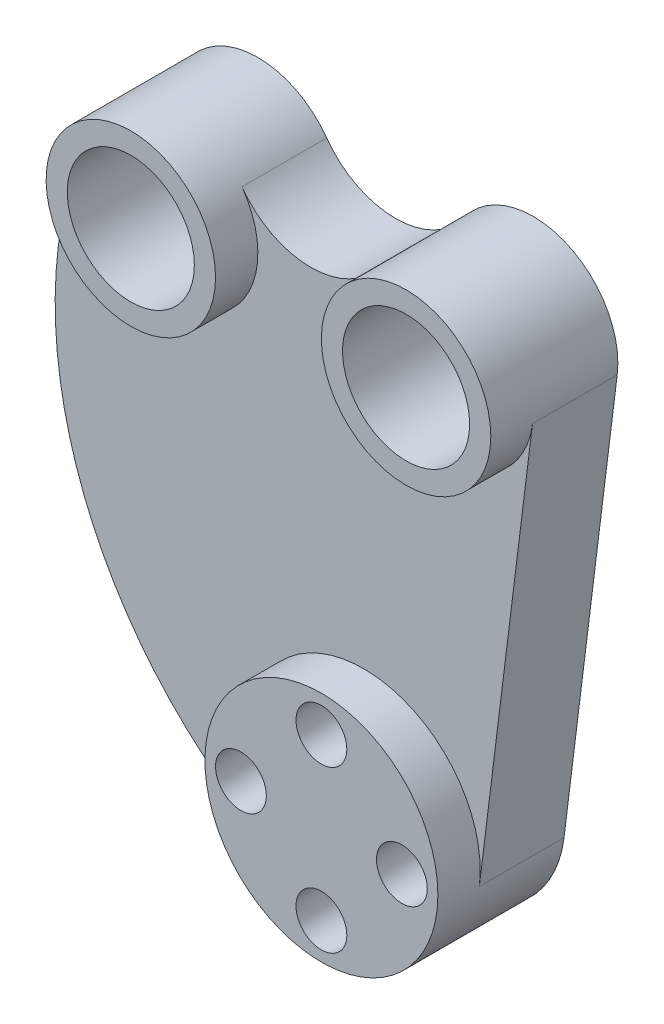
ISO-10303-21;
HEADER;
FILE_DESCRIPTION(('STEP AP214'),'2;1');
FILE_NAME('part.step','',(''),(''),'','','');
FILE_SCHEMA(('AUTOMOTIVE_DESIGN { 1 0 10303 214 1 1 1 1 }'));
ENDSEC;
DATA;
#1=APPLICATION_CONTEXT('core data for automotive mechanical design processes');
#2=APPLICATION_PROTOCOL_DEFINITION('international standard','automotive_design',2000,#1);
#3=PRODUCT_CONTEXT('',#1,'mechanical');
#4=PRODUCT('Part','Part','',(#3));
#5=PRODUCT_RELATED_PRODUCT_CATEGORY('part','',(#4));
#6=PRODUCT_DEFINITION_FORMATION('','',#4);
#7=PRODUCT_DEFINITION_CONTEXT('part definition',#1,'design');
#8=PRODUCT_DEFINITION('design','',#6,#7);
#9=PRODUCT_DEFINITION_SHAPE('','',#8);
#10=(LENGTH_UNIT() NAMED_UNIT(*) SI_UNIT(.MILLI.,.METRE.));
#11=(NAMED_UNIT(*) PLANE_ANGLE_UNIT() SI_UNIT($,.RADIAN.));
#12=(NAMED_UNIT(*) SI_UNIT($,.STERADIAN.) SOLID_ANGLE_UNIT());
#13=UNCERTAINTY_MEASURE_WITH_UNIT(LENGTH_MEASURE(1.E-05),#10,'distance_accuracy_value','');
#14=(GEOMETRIC_REPRESENTATION_CONTEXT(3) GLOBAL_UNCERTAINTY_ASSIGNED_CONTEXT((#13)) GLOBAL_UNIT_ASSIGNED_CONTEXT((#10,
#11,#12)) REPRESENTATION_CONTEXT('',''));
#15=CARTESIAN_POINT('',(0.,0.,0.));
#16=DIRECTION('',(0.,0.,1.));
#17=DIRECTION('',(1.,0.,0.));
#18=AXIS2_PLACEMENT_3D('',#15,#16,#17);
#19=CARTESIAN_POINT('',(70.1351833491974,-34.1329174928612,20.));
#20=DIRECTION('',(0.,0.,-1.));
#21=DIRECTION('',(-1.,0.,0.));
#22=AXIS2_PLACEMENT_3D('',#19,#20,#21);
#23=CYLINDRICAL_SURFACE('',#22,98.);
#24=CARTESIAN_POINT('',(70.1351833491974,-34.1329174928612,0.));
#25=DIRECTION('',(0.,0.,1.));
#26=DIRECTION('',(1.,0.,0.));
#27=AXIS2_PLACEMENT_3D('',#24,#25,#26);
#28=CIRCLE('',#27,98.);
#29=CARTESIAN_POINT('',(-17.983380345948,8.75203012637466,0.));
#30=VERTEX_POINT('',#29);
#31=CARTESIAN_POINT('',(35.1954958566961,-125.692833602075,0.));
#32=VERTEX_POINT('',#31);
#33=EDGE_CURVE('E111',#30,#32,#28,.T.);
#34=ORIENTED_EDGE('',*,*,#33,.T.);
#35=DIRECTION('',(0.,0.,-1.));
#36=VECTOR('',#35,1.);
#37=CARTESIAN_POINT('',(35.1954958566961,-125.692833602075,20.));
#38=LINE('',#37,#36);
#39=CARTESIAN_POINT('',(35.1954958566961,-125.692833602075,20.));
#40=VERTEX_POINT('',#39);
#41=EDGE_CURVE('E44',#40,#32,#38,.T.);
#42=ORIENTED_EDGE('',*,*,#41,.F.);
#43=CARTESIAN_POINT('',(70.1351833491974,-34.1329174928612,20.));
#44=DIRECTION('',(0.,0.,1.));
#45=DIRECTION('',(1.,0.,0.));
#46=AXIS2_PLACEMENT_3D('',#43,#44,#45);
#47=CIRCLE('',#46,98.);
#48=CARTESIAN_POINT('',(-17.983380345948,8.75203012637466,20.));
#49=VERTEX_POINT('',#48);
#50=EDGE_CURVE('E139',#49,#40,#47,.T.);
#51=ORIENTED_EDGE('',*,*,#50,.F.);
#52=DIRECTION('',(0.,0.,-1.));
#53=VECTOR('',#52,1.);
#54=CARTESIAN_POINT('',(-17.983380345948,8.75203012637466,20.));
#55=LINE('',#54,#53);
#56=EDGE_CURVE('E11',#49,#30,#55,.T.);
#57=ORIENTED_EDGE('',*,*,#56,.T.);
#58=EDGE_LOOP('',(#34,#42,#51,#57));
#59=FACE_BOUND('',#58,.T.);
#60=ADVANCED_FACE('F37',(#59),#23,.T.);
#61=CARTESIAN_POINT('',(83.8560575792752,-10.4335133267594,20.));
#62=DIRECTION('',(0.992348346481154,-0.123469669296231,0.));
#63=DIRECTION('',(0.123469669296231,0.992348346481154,0.));
#64=AXIS2_PLACEMENT_3D('',#61,#62,#63);
#65=PLANE('',#64);
#66=DIRECTION('',(-0.123469669296231,-0.992348346481154,0.));
#67=VECTOR('',#66,1.);
#68=CARTESIAN_POINT('',(83.8560575792752,-10.4335133267594,0.));
#69=LINE('',#68,#67);
#70=CARTESIAN_POINT('',(84.8469669296231,-2.46939338592461,0.));
#71=VERTEX_POINT('',#70);
#72=CARTESIAN_POINT('',(72.2895795282317,-103.395415905646,0.));
#73=VERTEX_POINT('',#72);
#74=EDGE_CURVE('E103',#71,#73,#69,.T.);
#75=ORIENTED_EDGE('',*,*,#74,.F.);
#76=DIRECTION('',(0.,0.,-1.));
#77=VECTOR('',#76,1.);
#78=CARTESIAN_POINT('',(84.8469669296231,-2.46939338592461,20.));
#79=LINE('',#78,#77);
#80=CARTESIAN_POINT('',(84.8469669296231,-2.46939338592462,20.));
#81=VERTEX_POINT('',#80);
#82=EDGE_CURVE('E106',#81,#71,#79,.T.);
#83=ORIENTED_EDGE('',*,*,#82,.F.);
#84=DIRECTION('',(-0.123469669296231,-0.992348346481154,0.));
#85=VECTOR('',#84,1.);
#86=CARTESIAN_POINT('',(83.8560575792752,-10.4335133267594,20.));
#87=LINE('',#86,#85);
#88=CARTESIAN_POINT('',(72.2895795282317,-103.395415905646,20.));
#89=VERTEX_POINT('',#88);
#90=EDGE_CURVE('E105',#81,#89,#87,.T.);
#91=ORIENTED_EDGE('',*,*,#90,.T.);
#92=DIRECTION('',(0.,0.,-1.));
#93=VECTOR('',#92,1.);
#94=CARTESIAN_POINT('',(72.2895795282317,-103.395415905646,20.));
#95=LINE('',#94,#93);
#96=EDGE_CURVE('E91',#89,#73,#95,.T.);
#97=ORIENTED_EDGE('',*,*,#96,.T.);
#98=EDGE_LOOP('',(#75,#83,#91,#97));
#99=FACE_BOUND('',#98,.T.);
#100=ADVANCED_FACE('F101',(#99),#65,.T.);
#101=CARTESIAN_POINT('',(32.5,23.318447632722,20.));
#102=DIRECTION('',(0.,0.,-1.));
#103=DIRECTION('',(-1.,0.,0.));
#104=AXIS2_PLACEMENT_3D('',#101,#102,#103);
#105=CYLINDRICAL_SURFACE('',#104,20.);
#106=CARTESIAN_POINT('',(32.5,23.318447632722,0.));
#107=DIRECTION('',(0.,0.,1.));
#108=DIRECTION('',(1.,0.,0.));
#109=AXIS2_PLACEMENT_3D('',#106,#107,#108);
#110=CIRCLE('',#109,20.);
#111=CARTESIAN_POINT('',(16.25,11.659223816361,0.));
#112=VERTEX_POINT('',#111);
#113=CARTESIAN_POINT('',(48.75,11.659223816361,0.));
#114=VERTEX_POINT('',#113);
#115=EDGE_CURVE('E110',#112,#114,#110,.T.);
#116=ORIENTED_EDGE('',*,*,#115,.F.);
#117=DIRECTION('',(0.,0.,-1.));
#118=VECTOR('',#117,1.);
#119=CARTESIAN_POINT('',(16.25,11.659223816361,20.));
#120=LINE('',#119,#118);
#121=CARTESIAN_POINT('',(16.25,11.659223816361,20.));
#122=VERTEX_POINT('',#121);
#123=EDGE_CURVE('E119',#122,#112,#120,.T.);
#124=ORIENTED_EDGE('',*,*,#123,.F.);
#125=CARTESIAN_POINT('',(32.5,23.318447632722,20.));
#126=DIRECTION('',(0.,0.,1.));
#127=DIRECTION('',(1.,0.,0.));
#128=AXIS2_PLACEMENT_3D('',#125,#126,#127);
#129=CIRCLE('',#128,20.);
#130=CARTESIAN_POINT('',(48.75,11.659223816361,20.));
#131=VERTEX_POINT('',#130);
#132=EDGE_CURVE('E122',#122,#131,#129,.T.);
#133=ORIENTED_EDGE('',*,*,#132,.T.);
#134=DIRECTION('',(0.,0.,-1.));
#135=VECTOR('',#134,1.);
#136=CARTESIAN_POINT('',(48.75,11.659223816361,20.));
#137=LINE('',#136,#135);
#138=EDGE_CURVE('E121',#131,#114,#137,.T.);
#139=ORIENTED_EDGE('',*,*,#138,.T.);
#140=EDGE_LOOP('',(#116,#124,#133,#139));
#141=FACE_BOUND('',#140,.T.);
#142=ADVANCED_FACE('F145',(#141),#105,.F.);
#143=CARTESIAN_POINT('',(0.,0.,20.));
#144=DIRECTION('',(0.,0.,1.));
#145=DIRECTION('',(1.,0.,0.));
#146=AXIS2_PLACEMENT_3D('',#143,#144,#145);
#147=PLANE('',#146);
#148=CARTESIAN_POINT('',(0.,0.,20.));
#149=DIRECTION('',(0.,0.,1.));
#150=DIRECTION('',(1.,0.,0.));
#151=AXIS2_PLACEMENT_3D('',#148,#149,#150);
#152=CIRCLE('',#151,20.);
#153=EDGE_CURVE('E113',#49,#122,#152,.T.);
#154=ORIENTED_EDGE('',*,*,#153,.F.);
#155=ORIENTED_EDGE('',*,*,#50,.T.);
#156=CARTESIAN_POINT('',(45.,-100.,20.));
#157=DIRECTION('',(0.,0.,1.));
#158=DIRECTION('',(1.,0.,0.));
#159=AXIS2_PLACEMENT_3D('',#156,#157,#158);
#160=CIRCLE('',#159,27.5);
#161=EDGE_CURVE('E136',#89,#40,#160,.T.);
#162=ORIENTED_EDGE('',*,*,#161,.F.);
#163=ORIENTED_EDGE('',*,*,#90,.F.);
#164=CARTESIAN_POINT('',(65.,0.,20.));
#165=DIRECTION('',(0.,0.,1.));
#166=DIRECTION('',(1.,0.,0.));
#167=AXIS2_PLACEMENT_3D('',#164,#165,#166);
#168=CIRCLE('',#167,20.);
#169=EDGE_CURVE('E129',#131,#81,#168,.T.);
#170=ORIENTED_EDGE('',*,*,#169,.F.);
#171=ORIENTED_EDGE('',*,*,#132,.F.);
#172=EDGE_LOOP('',(#154,#155,#162,#163,#170,#171));
#173=FACE_BOUND('',#172,.T.);
#174=ADVANCED_FACE('F132',(#173),#147,.T.);
#175=CARTESIAN_POINT('',(0.,0.,0.));
#176=DIRECTION('',(0.,0.,1.));
#177=DIRECTION('',(1.,0.,0.));
#178=AXIS2_PLACEMENT_3D('',#175,#176,#177);
#179=PLANE('',#178);
#180=ORIENTED_EDGE('',*,*,#33,.F.);
#181=CARTESIAN_POINT('',(0.,0.,0.));
#182=DIRECTION('',(0.,0.,1.));
#183=DIRECTION('',(1.,0.,0.));
#184=AXIS2_PLACEMENT_3D('',#181,#182,#183);
#185=CIRCLE('',#184,20.);
#186=EDGE_CURVE('E51',#112,#30,#185,.T.);
#187=ORIENTED_EDGE('',*,*,#186,.F.);
#188=ORIENTED_EDGE('',*,*,#115,.T.);
#189=CARTESIAN_POINT('',(65.,0.,0.));
#190=DIRECTION('',(0.,0.,1.));
#191=DIRECTION('',(1.,0.,0.));
#192=AXIS2_PLACEMENT_3D('',#189,#190,#191);
#193=CIRCLE('',#192,20.);
#194=EDGE_CURVE('E57',#71,#114,#193,.T.);
#195=ORIENTED_EDGE('',*,*,#194,.F.);
#196=ORIENTED_EDGE('',*,*,#74,.T.);
#197=CARTESIAN_POINT('',(45.,-100.,0.));
#198=DIRECTION('',(0.,0.,1.));
#199=DIRECTION('',(1.,0.,0.));
#200=AXIS2_PLACEMENT_3D('',#197,#198,#199);
#201=CIRCLE('',#200,27.5);
#202=EDGE_CURVE('E88',#32,#73,#201,.T.);
#203=ORIENTED_EDGE('',*,*,#202,.F.);
#204=EDGE_LOOP('',(#180,#187,#188,#195,#196,#203));
#205=FACE_BOUND('',#204,.T.);
#206=CARTESIAN_POINT('',(0.,0.,0.));
#207=DIRECTION('',(0.,0.,1.));
#208=DIRECTION('',(1.,0.,0.));
#209=AXIS2_PLACEMENT_3D('',#206,#207,#208);
#210=CIRCLE('',#209,15.);
#211=CARTESIAN_POINT('',(15.,0.,0.));
#212=VERTEX_POINT('',#211);
#213=EDGE_CURVE('E152',#212,#212,#210,.T.);
#214=ORIENTED_EDGE('',*,*,#213,.T.);
#215=EDGE_LOOP('',(#214));
#216=FACE_BOUND('',#215,.T.);
#217=CARTESIAN_POINT('',(65.,0.,0.));
#218=DIRECTION('',(0.,0.,1.));
#219=DIRECTION('',(1.,0.,0.));
#220=AXIS2_PLACEMENT_3D('',#217,#218,#219);
#221=CIRCLE('',#220,15.);
#222=CARTESIAN_POINT('',(80.,0.,0.));
#223=VERTEX_POINT('',#222);
#224=EDGE_CURVE('E162',#223,#223,#221,.T.);
#225=ORIENTED_EDGE('',*,*,#224,.T.);
#226=EDGE_LOOP('',(#225));
#227=FACE_BOUND('',#226,.T.);
#228=CARTESIAN_POINT('',(26.,-100.,0.));
#229=DIRECTION('',(0.,0.,1.));
#230=DIRECTION('',(1.,0.,0.));
#231=AXIS2_PLACEMENT_3D('',#228,#229,#230);
#232=CIRCLE('',#231,6.00000000000001);
#233=CARTESIAN_POINT('',(32.,-100.,0.));
#234=VERTEX_POINT('',#233);
#235=EDGE_CURVE('E178',#234,#234,#232,.T.);
#236=ORIENTED_EDGE('',*,*,#235,.T.);
#237=EDGE_LOOP('',(#236));
#238=FACE_BOUND('',#237,.T.);
#239=CARTESIAN_POINT('',(45.,-119.,0.));
#240=DIRECTION('',(0.,0.,1.));
#241=DIRECTION('',(1.,0.,0.));
#242=AXIS2_PLACEMENT_3D('',#239,#240,#241);
#243=CIRCLE('',#242,6.);
#244=CARTESIAN_POINT('',(51.,-119.,0.));
#245=VERTEX_POINT('',#244);
#246=EDGE_CURVE('E175',#245,#245,#243,.T.);
#247=ORIENTED_EDGE('',*,*,#246,.T.);
#248=EDGE_LOOP('',(#247));
#249=FACE_BOUND('',#248,.T.);
#250=CARTESIAN_POINT('',(64.,-100.,0.));
#251=DIRECTION('',(0.,0.,1.));
#252=DIRECTION('',(1.,0.,0.));
#253=AXIS2_PLACEMENT_3D('',#250,#251,#252);
#254=CIRCLE('',#253,6.);
#255=CARTESIAN_POINT('',(70.,-100.,0.));
#256=VERTEX_POINT('',#255);
#257=EDGE_CURVE('E172',#256,#256,#254,.T.);
#258=ORIENTED_EDGE('',*,*,#257,.T.);
#259=EDGE_LOOP('',(#258));
#260=FACE_BOUND('',#259,.T.);
#261=CARTESIAN_POINT('',(45.,-81.,0.));
#262=DIRECTION('',(0.,0.,1.));
#263=DIRECTION('',(1.,0.,0.));
#264=AXIS2_PLACEMENT_3D('',#261,#262,#263);
#265=CIRCLE('',#264,6.00000000000001);
#266=CARTESIAN_POINT('',(51.,-81.,0.));
#267=VERTEX_POINT('',#266);
#268=EDGE_CURVE('E96',#267,#267,#265,.T.);
#269=ORIENTED_EDGE('',*,*,#268,.T.);
#270=EDGE_LOOP('',(#269));
#271=FACE_BOUND('',#270,.T.);
#272=ADVANCED_FACE('F108',(#205,#216,#227,#238,#249,#260,#271),#179,.F.);
#273=CARTESIAN_POINT('',(0.,0.,30.));
#274=DIRECTION('',(0.,0.,-1.));
#275=DIRECTION('',(-1.,0.,0.));
#276=AXIS2_PLACEMENT_3D('',#273,#274,#275);
#277=CYLINDRICAL_SURFACE('',#276,15.);
#278=CARTESIAN_POINT('',(0.,0.,30.));
#279=DIRECTION('',(0.,0.,1.));
#280=DIRECTION('',(1.,0.,0.));
#281=AXIS2_PLACEMENT_3D('',#278,#279,#280);
#282=CIRCLE('',#281,15.);
#283=CARTESIAN_POINT('',(15.,0.,30.));
#284=VERTEX_POINT('',#283);
#285=EDGE_CURVE('E151',#284,#284,#282,.T.);
#286=ORIENTED_EDGE('',*,*,#285,.T.);
#287=EDGE_LOOP('',(#286));
#288=FACE_BOUND('',#287,.T.);
#289=ORIENTED_EDGE('',*,*,#213,.F.);
#290=EDGE_LOOP('',(#289));
#291=FACE_BOUND('',#290,.T.);
#292=ADVANCED_FACE('F232',(#288,#291),#277,.F.);
#293=CARTESIAN_POINT('',(0.,0.,30.));
#294=DIRECTION('',(0.,0.,-1.));
#295=DIRECTION('',(-1.,0.,0.));
#296=AXIS2_PLACEMENT_3D('',#293,#294,#295);
#297=CYLINDRICAL_SURFACE('',#296,20.);
#298=ORIENTED_EDGE('',*,*,#56,.F.);
#299=ORIENTED_EDGE('',*,*,#153,.T.);
#300=ORIENTED_EDGE('',*,*,#123,.T.);
#301=ORIENTED_EDGE('',*,*,#186,.T.);
#302=EDGE_LOOP('',(#298,#299,#300,#301));
#303=FACE_BOUND('',#302,.T.);
#304=CARTESIAN_POINT('',(0.,0.,30.));
#305=DIRECTION('',(0.,0.,1.));
#306=DIRECTION('',(1.,0.,0.));
#307=AXIS2_PLACEMENT_3D('',#304,#305,#306);
#308=CIRCLE('',#307,20.);
#309=CARTESIAN_POINT('',(20.,0.,30.));
#310=VERTEX_POINT('',#309);
#311=EDGE_CURVE('E115',#310,#310,#308,.T.);
#312=ORIENTED_EDGE('',*,*,#311,.F.);
#313=EDGE_LOOP('',(#312));
#314=FACE_BOUND('',#313,.T.);
#315=ADVANCED_FACE('F228',(#303,#314),#297,.T.);
#316=CARTESIAN_POINT('',(0.,0.,30.));
#317=DIRECTION('',(0.,0.,1.));
#318=DIRECTION('',(1.,0.,0.));
#319=AXIS2_PLACEMENT_3D('',#316,#317,#318);
#320=PLANE('',#319);
#321=ORIENTED_EDGE('',*,*,#285,.F.);
#322=EDGE_LOOP('',(#321));
#323=FACE_BOUND('',#322,.T.);
#324=ORIENTED_EDGE('',*,*,#311,.T.);
#325=EDGE_LOOP('',(#324));
#326=FACE_BOUND('',#325,.T.);
#327=ADVANCED_FACE('F231',(#323,#326),#320,.T.);
#328=CARTESIAN_POINT('',(65.,0.,30.));
#329=DIRECTION('',(0.,0.,-1.));
#330=DIRECTION('',(-1.,0.,0.));
#331=AXIS2_PLACEMENT_3D('',#328,#329,#330);
#332=CYLINDRICAL_SURFACE('',#331,15.);
#333=CARTESIAN_POINT('',(65.,0.,30.));
#334=DIRECTION('',(0.,0.,1.));
#335=DIRECTION('',(1.,0.,0.));
#336=AXIS2_PLACEMENT_3D('',#333,#334,#335);
#337=CIRCLE('',#336,15.);
#338=CARTESIAN_POINT('',(80.,0.,30.));
#339=VERTEX_POINT('',#338);
#340=EDGE_CURVE('E161',#339,#339,#337,.T.);
#341=ORIENTED_EDGE('',*,*,#340,.T.);
#342=EDGE_LOOP('',(#341));
#343=FACE_BOUND('',#342,.T.);
#344=ORIENTED_EDGE('',*,*,#224,.F.);
#345=EDGE_LOOP('',(#344));
#346=FACE_BOUND('',#345,.T.);
#347=ADVANCED_FACE('F237',(#343,#346),#332,.F.);
#348=CARTESIAN_POINT('',(65.,0.,30.));
#349=DIRECTION('',(0.,0.,-1.));
#350=DIRECTION('',(-1.,0.,0.));
#351=AXIS2_PLACEMENT_3D('',#348,#349,#350);
#352=CYLINDRICAL_SURFACE('',#351,20.);
#353=ORIENTED_EDGE('',*,*,#82,.T.);
#354=ORIENTED_EDGE('',*,*,#194,.T.);
#355=ORIENTED_EDGE('',*,*,#138,.F.);
#356=ORIENTED_EDGE('',*,*,#169,.T.);
#357=EDGE_LOOP('',(#353,#354,#355,#356));
#358=FACE_BOUND('',#357,.T.);
#359=CARTESIAN_POINT('',(65.,0.,30.));
#360=DIRECTION('',(0.,0.,1.));
#361=DIRECTION('',(1.,0.,0.));
#362=AXIS2_PLACEMENT_3D('',#359,#360,#361);
#363=CIRCLE('',#362,20.);
#364=CARTESIAN_POINT('',(85.,0.,30.));
#365=VERTEX_POINT('',#364);
#366=EDGE_CURVE('E155',#365,#365,#363,.T.);
#367=ORIENTED_EDGE('',*,*,#366,.F.);
#368=EDGE_LOOP('',(#367));
#369=FACE_BOUND('',#368,.T.);
#370=ADVANCED_FACE('F126',(#358,#369),#352,.T.);
#371=CARTESIAN_POINT('',(0.,0.,30.));
#372=DIRECTION('',(0.,0.,1.));
#373=DIRECTION('',(1.,0.,0.));
#374=AXIS2_PLACEMENT_3D('',#371,#372,#373);
#375=PLANE('',#374);
#376=ORIENTED_EDGE('',*,*,#340,.F.);
#377=EDGE_LOOP('',(#376));
#378=FACE_BOUND('',#377,.T.);
#379=ORIENTED_EDGE('',*,*,#366,.T.);
#380=EDGE_LOOP('',(#379));
#381=FACE_BOUND('',#380,.T.);
#382=ADVANCED_FACE('F212',(#378,#381),#375,.T.);
#383=CARTESIAN_POINT('',(45.,-100.,30.));
#384=DIRECTION('',(0.,0.,-1.));
#385=DIRECTION('',(-1.,0.,0.));
#386=AXIS2_PLACEMENT_3D('',#383,#384,#385);
#387=CYLINDRICAL_SURFACE('',#386,27.5);
#388=CARTESIAN_POINT('',(45.,-100.,30.));
#389=DIRECTION('',(0.,0.,1.));
#390=DIRECTION('',(1.,0.,0.));
#391=AXIS2_PLACEMENT_3D('',#388,#389,#390);
#392=CIRCLE('',#391,27.5);
#393=CARTESIAN_POINT('',(72.5,-100.,30.));
#394=VERTEX_POINT('',#393);
#395=EDGE_CURVE('E165',#394,#394,#392,.T.);
#396=ORIENTED_EDGE('',*,*,#395,.F.);
#397=EDGE_LOOP('',(#396));
#398=FACE_BOUND('',#397,.T.);
#399=ORIENTED_EDGE('',*,*,#161,.T.);
#400=ORIENTED_EDGE('',*,*,#41,.T.);
#401=ORIENTED_EDGE('',*,*,#202,.T.);
#402=ORIENTED_EDGE('',*,*,#96,.F.);
#403=EDGE_LOOP('',(#399,#400,#401,#402));
#404=FACE_BOUND('',#403,.T.);
#405=ADVANCED_FACE('F90',(#398,#404),#387,.T.);
#406=CARTESIAN_POINT('',(45.,-81.,30.));
#407=DIRECTION('',(0.,0.,-1.));
#408=DIRECTION('',(-1.,0.,0.));
#409=AXIS2_PLACEMENT_3D('',#406,#407,#408);
#410=CYLINDRICAL_SURFACE('',#409,6.00000000000001);
#411=CARTESIAN_POINT('',(45.,-81.,30.));
#412=DIRECTION('',(0.,0.,1.));
#413=DIRECTION('',(1.,0.,0.));
#414=AXIS2_PLACEMENT_3D('',#411,#412,#413);
#415=CIRCLE('',#414,6.00000000000001);
#416=CARTESIAN_POINT('',(51.,-81.,30.));
#417=VERTEX_POINT('',#416);
#418=EDGE_CURVE('E183',#417,#417,#415,.T.);
#419=ORIENTED_EDGE('',*,*,#418,.T.);
#420=EDGE_LOOP('',(#419));
#421=FACE_BOUND('',#420,.T.);
#422=ORIENTED_EDGE('',*,*,#268,.F.);
#423=EDGE_LOOP('',(#422));
#424=FACE_BOUND('',#423,.T.);
#425=ADVANCED_FACE('F211',(#421,#424),#410,.F.);
#426=CARTESIAN_POINT('',(64.,-100.,30.));
#427=DIRECTION('',(0.,0.,-1.));
#428=DIRECTION('',(-1.,0.,0.));
#429=AXIS2_PLACEMENT_3D('',#426,#427,#428);
#430=CYLINDRICAL_SURFACE('',#429,6.);
#431=CARTESIAN_POINT('',(64.,-100.,30.));
#432=DIRECTION('',(0.,0.,1.));
#433=DIRECTION('',(1.,0.,0.));
#434=AXIS2_PLACEMENT_3D('',#431,#432,#433);
#435=CIRCLE('',#434,6.);
#436=CARTESIAN_POINT('',(70.,-100.,30.));
#437=VERTEX_POINT('',#436);
#438=EDGE_CURVE('E186',#437,#437,#435,.T.);
#439=ORIENTED_EDGE('',*,*,#438,.T.);
#440=EDGE_LOOP('',(#439));
#441=FACE_BOUND('',#440,.T.);
#442=ORIENTED_EDGE('',*,*,#257,.F.);
#443=EDGE_LOOP('',(#442));
#444=FACE_BOUND('',#443,.T.);
#445=ADVANCED_FACE('F218',(#441,#444),#430,.F.);
#446=CARTESIAN_POINT('',(45.,-119.,30.));
#447=DIRECTION('',(0.,0.,-1.));
#448=DIRECTION('',(-1.,0.,0.));
#449=AXIS2_PLACEMENT_3D('',#446,#447,#448);
#450=CYLINDRICAL_SURFACE('',#449,6.);
#451=CARTESIAN_POINT('',(45.,-119.,30.));
#452=DIRECTION('',(0.,0.,1.));
#453=DIRECTION('',(1.,0.,0.));
#454=AXIS2_PLACEMENT_3D('',#451,#452,#453);
#455=CIRCLE('',#454,6.);
#456=CARTESIAN_POINT('',(51.,-119.,30.));
#457=VERTEX_POINT('',#456);
#458=EDGE_CURVE('E189',#457,#457,#455,.T.);
#459=ORIENTED_EDGE('',*,*,#458,.T.);
#460=EDGE_LOOP('',(#459));
#461=FACE_BOUND('',#460,.T.);
#462=ORIENTED_EDGE('',*,*,#246,.F.);
#463=EDGE_LOOP('',(#462));
#464=FACE_BOUND('',#463,.T.);
#465=ADVANCED_FACE('F325',(#461,#464),#450,.F.);
#466=CARTESIAN_POINT('',(26.,-100.,30.));
#467=DIRECTION('',(0.,0.,-1.));
#468=DIRECTION('',(-1.,0.,0.));
#469=AXIS2_PLACEMENT_3D('',#466,#467,#468);
#470=CYLINDRICAL_SURFACE('',#469,6.00000000000001);
#471=CARTESIAN_POINT('',(26.,-100.,30.));
#472=DIRECTION('',(0.,0.,1.));
#473=DIRECTION('',(1.,0.,0.));
#474=AXIS2_PLACEMENT_3D('',#471,#472,#473);
#475=CIRCLE('',#474,6.00000000000001);
#476=CARTESIAN_POINT('',(32.,-100.,30.));
#477=VERTEX_POINT('',#476);
#478=EDGE_CURVE('E95',#477,#477,#475,.T.);
#479=ORIENTED_EDGE('',*,*,#478,.T.);
#480=EDGE_LOOP('',(#479));
#481=FACE_BOUND('',#480,.T.);
#482=ORIENTED_EDGE('',*,*,#235,.F.);
#483=EDGE_LOOP('',(#482));
#484=FACE_BOUND('',#483,.T.);
#485=ADVANCED_FACE('F195',(#481,#484),#470,.F.);
#486=CARTESIAN_POINT('',(0.,0.,30.));
#487=DIRECTION('',(0.,0.,1.));
#488=DIRECTION('',(1.,0.,0.));
#489=AXIS2_PLACEMENT_3D('',#486,#487,#488);
#490=PLANE('',#489);
#491=ORIENTED_EDGE('',*,*,#478,.F.);
#492=EDGE_LOOP('',(#491));
#493=FACE_BOUND('',#492,.T.);
#494=ORIENTED_EDGE('',*,*,#458,.F.);
#495=EDGE_LOOP('',(#494));
#496=FACE_BOUND('',#495,.T.);
#497=ORIENTED_EDGE('',*,*,#438,.F.);
#498=EDGE_LOOP('',(#497));
#499=FACE_BOUND('',#498,.T.);
#500=ORIENTED_EDGE('',*,*,#418,.F.);
#501=EDGE_LOOP('',(#500));
#502=FACE_BOUND('',#501,.T.);
#503=ORIENTED_EDGE('',*,*,#395,.T.);
#504=EDGE_LOOP('',(#503));
#505=FACE_BOUND('',#504,.T.);
#506=ADVANCED_FACE('F198',(#493,#496,#499,#502,#505),#490,.T.);
#507=CLOSED_SHELL('',(#60,#100,#142,#174,#272,#292,#315,#327,#347,#370,#382,#405,#425,#445,#465,
#485,#506));
#508=MANIFOLD_SOLID_BREP('B2',#507);
#509=ADVANCED_BREP_SHAPE_REPRESENTATION('',(#18,#508),#14);
#510=SHAPE_DEFINITION_REPRESENTATION(#9,#509);
ENDSEC;
END-ISO-10303-21;
